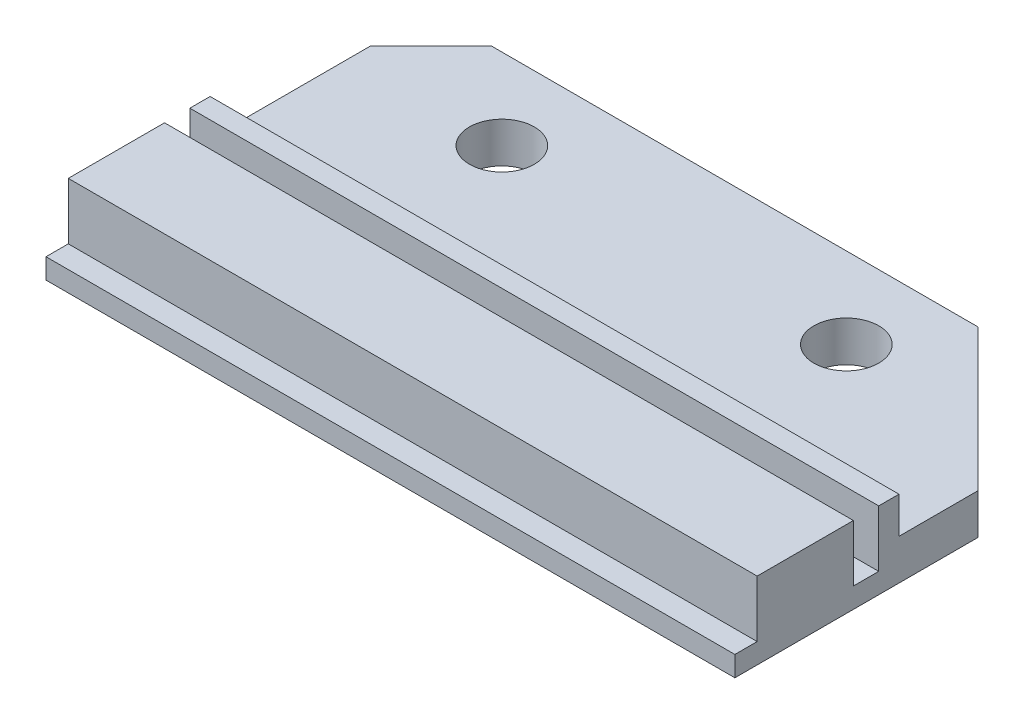
ISO-10303-21;
HEADER;
FILE_DESCRIPTION(('STEP AP214'),'2;1');
FILE_NAME('part.step','',(''),(''),'','','');
FILE_SCHEMA(('AUTOMOTIVE_DESIGN { 1 0 10303 214 1 1 1 1 }'));
ENDSEC;
DATA;
#1=APPLICATION_CONTEXT('core data for automotive mechanical design processes');
#2=APPLICATION_PROTOCOL_DEFINITION('international standard','automotive_design',2000,#1);
#3=PRODUCT_CONTEXT('',#1,'mechanical');
#4=PRODUCT('Part','Part','',(#3));
#5=PRODUCT_RELATED_PRODUCT_CATEGORY('part','',(#4));
#6=PRODUCT_DEFINITION_FORMATION('','',#4);
#7=PRODUCT_DEFINITION_CONTEXT('part definition',#1,'design');
#8=PRODUCT_DEFINITION('design','',#6,#7);
#9=PRODUCT_DEFINITION_SHAPE('','',#8);
#10=(LENGTH_UNIT() NAMED_UNIT(*) SI_UNIT(.MILLI.,.METRE.));
#11=(NAMED_UNIT(*) PLANE_ANGLE_UNIT() SI_UNIT($,.RADIAN.));
#12=(NAMED_UNIT(*) SI_UNIT($,.STERADIAN.) SOLID_ANGLE_UNIT());
#13=UNCERTAINTY_MEASURE_WITH_UNIT(LENGTH_MEASURE(1.E-05),#10,'distance_accuracy_value','');
#14=(GEOMETRIC_REPRESENTATION_CONTEXT(3) GLOBAL_UNCERTAINTY_ASSIGNED_CONTEXT((#13)) GLOBAL_UNIT_ASSIGNED_CONTEXT((#10,
#11,#12)) REPRESENTATION_CONTEXT('',''));
#15=CARTESIAN_POINT('',(0.,0.,0.));
#16=DIRECTION('',(0.,0.,1.));
#17=DIRECTION('',(1.,0.,0.));
#18=AXIS2_PLACEMENT_3D('',#15,#16,#17);
#19=CARTESIAN_POINT('',(0.,1.,0.));
#20=DIRECTION('',(0.,1.,0.));
#21=DIRECTION('',(0.,0.,1.));
#22=AXIS2_PLACEMENT_3D('',#19,#20,#21);
#23=PLANE('',#22);
#24=DIRECTION('',(0.,0.,-1.));
#25=VECTOR('',#24,1.);
#26=CARTESIAN_POINT('',(-7.49999999999999,1.,0.));
#27=LINE('',#26,#25);
#28=CARTESIAN_POINT('',(-7.49999999999999,1.,9.15));
#29=VERTEX_POINT('',#28);
#30=CARTESIAN_POINT('',(-7.49999999999999,1.,7.9));
#31=VERTEX_POINT('',#30);
#32=EDGE_CURVE('E372',#29,#31,#27,.T.);
#33=ORIENTED_EDGE('',*,*,#32,.F.);
#34=DIRECTION('',(-1.,0.,0.));
#35=VECTOR('',#34,1.);
#36=CARTESIAN_POINT('',(-7.5,1.,9.15));
#37=LINE('',#36,#35);
#38=CARTESIAN_POINT('',(26.5,1.,9.15));
#39=VERTEX_POINT('',#38);
#40=EDGE_CURVE('E262',#39,#29,#37,.T.);
#41=ORIENTED_EDGE('',*,*,#40,.F.);
#42=DIRECTION('',(0.,0.,1.));
#43=VECTOR('',#42,1.);
#44=CARTESIAN_POINT('',(26.5,1.,7.9));
#45=LINE('',#44,#43);
#46=CARTESIAN_POINT('',(26.5,1.,7.9));
#47=VERTEX_POINT('',#46);
#48=EDGE_CURVE('E236',#47,#39,#45,.T.);
#49=ORIENTED_EDGE('',*,*,#48,.F.);
#50=DIRECTION('',(1.,0.,0.));
#51=VECTOR('',#50,1.);
#52=CARTESIAN_POINT('',(-7.5,1.,7.9));
#53=LINE('',#52,#51);
#54=EDGE_CURVE('E251',#31,#47,#53,.T.);
#55=ORIENTED_EDGE('',*,*,#54,.F.);
#56=EDGE_LOOP('',(#33,#41,#49,#55));
#57=FACE_BOUND('',#56,.T.);
#58=ADVANCED_FACE('F45',(#57),#23,.T.);
#59=DIRECTION('',(0.,0.,-1.));
#60=VECTOR('',#59,1.);
#61=CARTESIAN_POINT('',(-7.49999999999999,1.,0.));
#62=LINE('',#61,#60);
#63=CARTESIAN_POINT('',(-7.49999999999999,1.,15.));
#64=VERTEX_POINT('',#63);
#65=CARTESIAN_POINT('',(-7.49999999999999,1.,13.9));
#66=VERTEX_POINT('',#65);
#67=EDGE_CURVE('E374',#64,#66,#62,.T.);
#68=ORIENTED_EDGE('',*,*,#67,.F.);
#69=DIRECTION('',(1.,0.,0.));
#70=VECTOR('',#69,1.);
#71=CARTESIAN_POINT('',(-7.5,1.,15.));
#72=LINE('',#71,#70);
#73=CARTESIAN_POINT('',(26.5,1.,15.));
#74=VERTEX_POINT('',#73);
#75=EDGE_CURVE('E177',#64,#74,#72,.T.);
#76=ORIENTED_EDGE('',*,*,#75,.T.);
#77=DIRECTION('',(0.,0.,1.));
#78=VECTOR('',#77,1.);
#79=CARTESIAN_POINT('',(26.5,1.,13.9));
#80=LINE('',#79,#78);
#81=CARTESIAN_POINT('',(26.5,1.,13.9));
#82=VERTEX_POINT('',#81);
#83=EDGE_CURVE('E248',#82,#74,#80,.T.);
#84=ORIENTED_EDGE('',*,*,#83,.F.);
#85=DIRECTION('',(1.,0.,0.));
#86=VECTOR('',#85,1.);
#87=CARTESIAN_POINT('',(-7.5,1.,13.9));
#88=LINE('',#87,#86);
#89=EDGE_CURVE('E256',#66,#82,#88,.T.);
#90=ORIENTED_EDGE('',*,*,#89,.F.);
#91=EDGE_LOOP('',(#68,#76,#84,#90));
#92=FACE_BOUND('',#91,.T.);
#93=ADVANCED_FACE('F305',(#92),#23,.T.);
#94=CARTESIAN_POINT('',(0.,0.,0.));
#95=DIRECTION('',(0.,1.,0.));
#96=DIRECTION('',(0.,0.,1.));
#97=AXIS2_PLACEMENT_3D('',#94,#95,#96);
#98=PLANE('',#97);
#99=DIRECTION('',(0.,0.,1.));
#100=VECTOR('',#99,1.);
#101=CARTESIAN_POINT('',(-7.49999999999999,0.,15.));
#102=LINE('',#101,#100);
#103=CARTESIAN_POINT('',(-7.49999999999999,0.,-0.999999999999971));
#104=VERTEX_POINT('',#103);
#105=CARTESIAN_POINT('',(-7.49999999999999,0.,15.));
#106=VERTEX_POINT('',#105);
#107=EDGE_CURVE('E161',#104,#106,#102,.T.);
#108=ORIENTED_EDGE('',*,*,#107,.F.);
#109=DIRECTION('',(-0.707106781186546,0.,0.707106781186549));
#110=VECTOR('',#109,1.);
#111=CARTESIAN_POINT('',(-4.49999999999998,0.,-4.));
#112=LINE('',#111,#110);
#113=CARTESIAN_POINT('',(-4.49999999999998,0.,-4.));
#114=VERTEX_POINT('',#113);
#115=EDGE_CURVE('E12',#104,#114,#112,.F.);
#116=ORIENTED_EDGE('',*,*,#115,.T.);
#117=DIRECTION('',(-1.,0.,0.));
#118=VECTOR('',#117,1.);
#119=CARTESIAN_POINT('',(-7.5,0.,-4.));
#120=LINE('',#119,#118);
#121=CARTESIAN_POINT('',(19.5,0.,-4.));
#122=VERTEX_POINT('',#121);
#123=EDGE_CURVE('E186',#122,#114,#120,.T.);
#124=ORIENTED_EDGE('',*,*,#123,.F.);
#125=DIRECTION('',(0.707106781186549,0.,0.707106781186546));
#126=VECTOR('',#125,1.);
#127=CARTESIAN_POINT('',(26.5,0.,3.));
#128=LINE('',#127,#126);
#129=CARTESIAN_POINT('',(26.5,0.,3.));
#130=VERTEX_POINT('',#129);
#131=EDGE_CURVE('E200',#122,#130,#128,.T.);
#132=ORIENTED_EDGE('',*,*,#131,.T.);
#133=DIRECTION('',(0.,0.,-1.));
#134=VECTOR('',#133,1.);
#135=CARTESIAN_POINT('',(26.5,0.,15.));
#136=LINE('',#135,#134);
#137=CARTESIAN_POINT('',(26.5,0.,15.));
#138=VERTEX_POINT('',#137);
#139=EDGE_CURVE('E184',#138,#130,#136,.T.);
#140=ORIENTED_EDGE('',*,*,#139,.F.);
#141=DIRECTION('',(1.,0.,0.));
#142=VECTOR('',#141,1.);
#143=CARTESIAN_POINT('',(-7.5,0.,15.));
#144=LINE('',#143,#142);
#145=EDGE_CURVE('E175',#106,#138,#144,.T.);
#146=ORIENTED_EDGE('',*,*,#145,.F.);
#147=EDGE_LOOP('',(#108,#116,#124,#132,#140,#146));
#148=FACE_BOUND('',#147,.T.);
#149=CARTESIAN_POINT('',(0.,0.,0.));
#150=DIRECTION('',(0.,1.,0.));
#151=DIRECTION('',(0.,0.,1.));
#152=AXIS2_PLACEMENT_3D('',#149,#150,#151);
#153=CIRCLE('',#152,1.6);
#154=CARTESIAN_POINT('',(0.,0.,1.6));
#155=VERTEX_POINT('',#154);
#156=EDGE_CURVE('E187',#155,#155,#153,.T.);
#157=ORIENTED_EDGE('',*,*,#156,.T.);
#158=EDGE_LOOP('',(#157));
#159=FACE_BOUND('',#158,.T.);
#160=CARTESIAN_POINT('',(17.,0.,0.));
#161=DIRECTION('',(0.,1.,0.));
#162=DIRECTION('',(0.,0.,1.));
#163=AXIS2_PLACEMENT_3D('',#160,#161,#162);
#164=CIRCLE('',#163,1.60000000000001);
#165=CARTESIAN_POINT('',(17.,0.,1.6));
#166=VERTEX_POINT('',#165);
#167=EDGE_CURVE('E192',#166,#166,#164,.T.);
#168=ORIENTED_EDGE('',*,*,#167,.T.);
#169=EDGE_LOOP('',(#168));
#170=FACE_BOUND('',#169,.T.);
#171=ADVANCED_FACE('F181',(#148,#159,#170),#98,.F.);
#172=CARTESIAN_POINT('',(-7.5,1.,15.));
#173=DIRECTION('',(0.,0.,-1.));
#174=DIRECTION('',(-1.,0.,0.));
#175=AXIS2_PLACEMENT_3D('',#172,#173,#174);
#176=PLANE('',#175);
#177=ORIENTED_EDGE('',*,*,#75,.F.);
#178=DIRECTION('',(0.,-1.,0.));
#179=VECTOR('',#178,1.);
#180=CARTESIAN_POINT('',(-7.49999999999999,3.8,15.));
#181=LINE('',#180,#179);
#182=EDGE_CURVE('E164',#64,#106,#181,.T.);
#183=ORIENTED_EDGE('',*,*,#182,.T.);
#184=ORIENTED_EDGE('',*,*,#145,.T.);
#185=DIRECTION('',(0.,-1.,0.));
#186=VECTOR('',#185,1.);
#187=CARTESIAN_POINT('',(26.5,1.,15.));
#188=LINE('',#187,#186);
#189=EDGE_CURVE('E220',#74,#138,#188,.T.);
#190=ORIENTED_EDGE('',*,*,#189,.F.);
#191=EDGE_LOOP('',(#177,#183,#184,#190));
#192=FACE_BOUND('',#191,.T.);
#193=ADVANCED_FACE('F173',(#192),#176,.F.);
#194=CARTESIAN_POINT('',(-7.5,1.,-4.));
#195=DIRECTION('',(0.,0.,1.));
#196=DIRECTION('',(1.,0.,0.));
#197=AXIS2_PLACEMENT_3D('',#194,#195,#196);
#198=PLANE('',#197);
#199=ORIENTED_EDGE('',*,*,#123,.T.);
#200=DIRECTION('',(0.,1.,0.));
#201=VECTOR('',#200,1.);
#202=CARTESIAN_POINT('',(-4.49999999999998,1.,-4.));
#203=LINE('',#202,#201);
#204=CARTESIAN_POINT('',(-4.49999999999997,2.,-4.));
#205=VERTEX_POINT('',#204);
#206=EDGE_CURVE('E204',#114,#205,#203,.T.);
#207=ORIENTED_EDGE('',*,*,#206,.T.);
#208=DIRECTION('',(-1.,0.,0.));
#209=VECTOR('',#208,1.);
#210=CARTESIAN_POINT('',(19.5,2.,-4.));
#211=LINE('',#210,#209);
#212=CARTESIAN_POINT('',(19.5,2.,-4.));
#213=VERTEX_POINT('',#212);
#214=EDGE_CURVE('E211',#213,#205,#211,.T.);
#215=ORIENTED_EDGE('',*,*,#214,.F.);
#216=DIRECTION('',(0.,-1.,0.));
#217=VECTOR('',#216,1.);
#218=CARTESIAN_POINT('',(19.5,0.,-4.));
#219=LINE('',#218,#217);
#220=EDGE_CURVE('E198',#213,#122,#219,.T.);
#221=ORIENTED_EDGE('',*,*,#220,.T.);
#222=EDGE_LOOP('',(#199,#207,#215,#221));
#223=FACE_BOUND('',#222,.T.);
#224=ADVANCED_FACE('F210',(#223),#198,.F.);
#225=CARTESIAN_POINT('',(0.,1.,0.));
#226=DIRECTION('',(0.,-1.,0.));
#227=DIRECTION('',(0.,0.,-1.));
#228=AXIS2_PLACEMENT_3D('',#225,#226,#227);
#229=CYLINDRICAL_SURFACE('',#228,1.6);
#230=ORIENTED_EDGE('',*,*,#156,.F.);
#231=EDGE_LOOP('',(#230));
#232=FACE_BOUND('',#231,.T.);
#233=CARTESIAN_POINT('',(0.,2.,0.));
#234=DIRECTION('',(0.,1.,0.));
#235=DIRECTION('',(0.,0.,1.));
#236=AXIS2_PLACEMENT_3D('',#233,#234,#235);
#237=CIRCLE('',#236,1.6);
#238=CARTESIAN_POINT('',(0.,2.,1.6));
#239=VERTEX_POINT('',#238);
#240=EDGE_CURVE('E282',#239,#239,#237,.T.);
#241=ORIENTED_EDGE('',*,*,#240,.T.);
#242=EDGE_LOOP('',(#241));
#243=FACE_BOUND('',#242,.T.);
#244=ADVANCED_FACE('F276',(#232,#243),#229,.F.);
#245=CARTESIAN_POINT('',(17.,1.,0.));
#246=DIRECTION('',(0.,-1.,0.));
#247=DIRECTION('',(0.,0.,-1.));
#248=AXIS2_PLACEMENT_3D('',#245,#246,#247);
#249=CYLINDRICAL_SURFACE('',#248,1.60000000000001);
#250=ORIENTED_EDGE('',*,*,#167,.F.);
#251=EDGE_LOOP('',(#250));
#252=FACE_BOUND('',#251,.T.);
#253=CARTESIAN_POINT('',(17.,2.,0.));
#254=DIRECTION('',(0.,1.,0.));
#255=DIRECTION('',(0.,0.,1.));
#256=AXIS2_PLACEMENT_3D('',#253,#254,#255);
#257=CIRCLE('',#256,1.60000000000001);
#258=CARTESIAN_POINT('',(17.,2.,1.6));
#259=VERTEX_POINT('',#258);
#260=EDGE_CURVE('E280',#259,#259,#257,.T.);
#261=ORIENTED_EDGE('',*,*,#260,.T.);
#262=EDGE_LOOP('',(#261));
#263=FACE_BOUND('',#262,.T.);
#264=ADVANCED_FACE('F272',(#252,#263),#249,.F.);
#265=CARTESIAN_POINT('',(-7.5,3.8,13.9));
#266=DIRECTION('',(0.,0.,-1.));
#267=DIRECTION('',(-1.,0.,0.));
#268=AXIS2_PLACEMENT_3D('',#265,#266,#267);
#269=PLANE('',#268);
#270=DIRECTION('',(1.,0.,0.));
#271=VECTOR('',#270,1.);
#272=CARTESIAN_POINT('',(-7.5,3.8,13.9));
#273=LINE('',#272,#271);
#274=CARTESIAN_POINT('',(-7.49999999999999,3.8,13.9));
#275=VERTEX_POINT('',#274);
#276=CARTESIAN_POINT('',(26.5,3.8,13.9));
#277=VERTEX_POINT('',#276);
#278=EDGE_CURVE('E259',#275,#277,#273,.T.);
#279=ORIENTED_EDGE('',*,*,#278,.F.);
#280=DIRECTION('',(0.,-1.,0.));
#281=VECTOR('',#280,1.);
#282=CARTESIAN_POINT('',(-7.49999999999999,3.8,13.9));
#283=LINE('',#282,#281);
#284=EDGE_CURVE('E363',#275,#66,#283,.T.);
#285=ORIENTED_EDGE('',*,*,#284,.T.);
#286=ORIENTED_EDGE('',*,*,#89,.T.);
#287=DIRECTION('',(0.,-1.,0.));
#288=VECTOR('',#287,1.);
#289=CARTESIAN_POINT('',(26.5,3.8,13.9));
#290=LINE('',#289,#288);
#291=EDGE_CURVE('E245',#277,#82,#290,.T.);
#292=ORIENTED_EDGE('',*,*,#291,.F.);
#293=EDGE_LOOP('',(#279,#285,#286,#292));
#294=FACE_BOUND('',#293,.T.);
#295=ADVANCED_FACE('F275',(#294),#269,.F.);
#296=CARTESIAN_POINT('',(-7.5,3.8,9.15));
#297=DIRECTION('',(0.,0.,1.));
#298=DIRECTION('',(1.,0.,0.));
#299=AXIS2_PLACEMENT_3D('',#296,#297,#298);
#300=PLANE('',#299);
#301=ORIENTED_EDGE('',*,*,#40,.T.);
#302=DIRECTION('',(0.,1.,0.));
#303=VECTOR('',#302,1.);
#304=CARTESIAN_POINT('',(-7.49999999999999,3.8,9.15));
#305=LINE('',#304,#303);
#306=CARTESIAN_POINT('',(-7.49999999999999,3.8,9.15));
#307=VERTEX_POINT('',#306);
#308=EDGE_CURVE('E371',#29,#307,#305,.T.);
#309=ORIENTED_EDGE('',*,*,#308,.T.);
#310=DIRECTION('',(-1.,0.,0.));
#311=VECTOR('',#310,1.);
#312=CARTESIAN_POINT('',(-7.5,3.8,9.15));
#313=LINE('',#312,#311);
#314=CARTESIAN_POINT('',(26.5,3.8,9.15));
#315=VERTEX_POINT('',#314);
#316=EDGE_CURVE('E261',#315,#307,#313,.T.);
#317=ORIENTED_EDGE('',*,*,#316,.F.);
#318=DIRECTION('',(0.,1.,0.));
#319=VECTOR('',#318,1.);
#320=CARTESIAN_POINT('',(26.5,1.,9.15));
#321=LINE('',#320,#319);
#322=EDGE_CURVE('E239',#39,#315,#321,.T.);
#323=ORIENTED_EDGE('',*,*,#322,.F.);
#324=EDGE_LOOP('',(#301,#309,#317,#323));
#325=FACE_BOUND('',#324,.T.);
#326=ADVANCED_FACE('F351',(#325),#300,.F.);
#327=CARTESIAN_POINT('',(0.,3.8,0.));
#328=DIRECTION('',(0.,1.,0.));
#329=DIRECTION('',(0.,0.,1.));
#330=AXIS2_PLACEMENT_3D('',#327,#328,#329);
#331=PLANE('',#330);
#332=DIRECTION('',(0.,0.,1.));
#333=VECTOR('',#332,1.);
#334=CARTESIAN_POINT('',(-7.49999999999999,3.8,15.));
#335=LINE('',#334,#333);
#336=EDGE_CURVE('E169',#307,#275,#335,.T.);
#337=ORIENTED_EDGE('',*,*,#336,.T.);
#338=ORIENTED_EDGE('',*,*,#278,.T.);
#339=DIRECTION('',(0.,0.,1.));
#340=VECTOR('',#339,1.);
#341=CARTESIAN_POINT('',(26.5,3.8,9.15));
#342=LINE('',#341,#340);
#343=EDGE_CURVE('E242',#315,#277,#342,.T.);
#344=ORIENTED_EDGE('',*,*,#343,.F.);
#345=ORIENTED_EDGE('',*,*,#316,.T.);
#346=EDGE_LOOP('',(#337,#338,#344,#345));
#347=FACE_BOUND('',#346,.T.);
#348=ADVANCED_FACE('F346',(#347),#331,.T.);
#349=CARTESIAN_POINT('',(-7.5,35.8156211871642,7.9));
#350=DIRECTION('',(0.,0.,-1.));
#351=DIRECTION('',(-1.,0.,0.));
#352=AXIS2_PLACEMENT_3D('',#349,#350,#351);
#353=PLANE('',#352);
#354=DIRECTION('',(1.,0.,0.));
#355=VECTOR('',#354,1.);
#356=CARTESIAN_POINT('',(-7.5,3.8,7.9));
#357=LINE('',#356,#355);
#358=CARTESIAN_POINT('',(-7.49999999999999,3.8,7.9));
#359=VERTEX_POINT('',#358);
#360=CARTESIAN_POINT('',(26.5,3.8,7.9));
#361=VERTEX_POINT('',#360);
#362=EDGE_CURVE('E254',#359,#361,#357,.T.);
#363=ORIENTED_EDGE('',*,*,#362,.F.);
#364=DIRECTION('',(0.,-1.,0.));
#365=VECTOR('',#364,1.);
#366=CARTESIAN_POINT('',(-7.49999999999999,35.8156211871642,7.9));
#367=LINE('',#366,#365);
#368=EDGE_CURVE('E376',#359,#31,#367,.T.);
#369=ORIENTED_EDGE('',*,*,#368,.T.);
#370=ORIENTED_EDGE('',*,*,#54,.T.);
#371=DIRECTION('',(0.,-1.,0.));
#372=VECTOR('',#371,1.);
#373=CARTESIAN_POINT('',(26.5,3.8,7.9));
#374=LINE('',#373,#372);
#375=EDGE_CURVE('E233',#361,#47,#374,.T.);
#376=ORIENTED_EDGE('',*,*,#375,.F.);
#377=EDGE_LOOP('',(#363,#369,#370,#376));
#378=FACE_BOUND('',#377,.T.);
#379=ADVANCED_FACE('F343',(#378),#353,.F.);
#380=CARTESIAN_POINT('',(-7.5,35.8156211871642,6.9));
#381=DIRECTION('',(0.,0.,1.));
#382=DIRECTION('',(1.,0.,0.));
#383=AXIS2_PLACEMENT_3D('',#380,#381,#382);
#384=PLANE('',#383);
#385=DIRECTION('',(-1.,0.,0.));
#386=VECTOR('',#385,1.);
#387=CARTESIAN_POINT('',(-10.5,1.,6.9));
#388=LINE('',#387,#386);
#389=CARTESIAN_POINT('',(16.5,1.,6.9));
#390=VERTEX_POINT('',#389);
#391=CARTESIAN_POINT('',(-7.49999999999999,1.,6.9));
#392=VERTEX_POINT('',#391);
#393=EDGE_CURVE('E286',#390,#392,#388,.T.);
#394=ORIENTED_EDGE('',*,*,#393,.T.);
#395=DIRECTION('',(0.,1.,0.));
#396=VECTOR('',#395,1.);
#397=CARTESIAN_POINT('',(-7.49999999999999,35.8156211871642,6.9));
#398=LINE('',#397,#396);
#399=CARTESIAN_POINT('',(-7.49999999999999,3.8,6.9));
#400=VERTEX_POINT('',#399);
#401=EDGE_CURVE('E399',#392,#400,#398,.T.);
#402=ORIENTED_EDGE('',*,*,#401,.T.);
#403=DIRECTION('',(-1.,0.,0.));
#404=VECTOR('',#403,1.);
#405=CARTESIAN_POINT('',(-7.5,3.8,6.9));
#406=LINE('',#405,#404);
#407=CARTESIAN_POINT('',(26.5,3.8,6.9));
#408=VERTEX_POINT('',#407);
#409=EDGE_CURVE('E253',#408,#400,#406,.T.);
#410=ORIENTED_EDGE('',*,*,#409,.F.);
#411=DIRECTION('',(0.,1.,0.));
#412=VECTOR('',#411,1.);
#413=CARTESIAN_POINT('',(26.5,1.,6.9));
#414=LINE('',#413,#412);
#415=CARTESIAN_POINT('',(26.5,2.,6.9));
#416=VERTEX_POINT('',#415);
#417=EDGE_CURVE('E228',#416,#408,#414,.T.);
#418=ORIENTED_EDGE('',*,*,#417,.F.);
#419=DIRECTION('',(1.,0.,0.));
#420=VECTOR('',#419,1.);
#421=CARTESIAN_POINT('',(-14.5,2.,6.9));
#422=LINE('',#421,#420);
#423=CARTESIAN_POINT('',(16.5,2.,6.9));
#424=VERTEX_POINT('',#423);
#425=EDGE_CURVE('E281',#424,#416,#422,.T.);
#426=ORIENTED_EDGE('',*,*,#425,.F.);
#427=DIRECTION('',(0.,1.,0.));
#428=VECTOR('',#427,1.);
#429=CARTESIAN_POINT('',(16.5,-27.0416345659799,6.9));
#430=LINE('',#429,#428);
#431=EDGE_CURVE('E392',#390,#424,#430,.T.);
#432=ORIENTED_EDGE('',*,*,#431,.F.);
#433=EDGE_LOOP('',(#394,#402,#410,#418,#426,#432));
#434=FACE_BOUND('',#433,.T.);
#435=ADVANCED_FACE('F336',(#434),#384,.F.);
#436=CARTESIAN_POINT('',(0.,3.8,0.));
#437=DIRECTION('',(0.,1.,0.));
#438=DIRECTION('',(0.,0.,1.));
#439=AXIS2_PLACEMENT_3D('',#436,#437,#438);
#440=PLANE('',#439);
#441=EDGE_CURVE('E179',#400,#359,#335,.T.);
#442=ORIENTED_EDGE('',*,*,#441,.T.);
#443=ORIENTED_EDGE('',*,*,#362,.T.);
#444=DIRECTION('',(0.,0.,1.));
#445=VECTOR('',#444,1.);
#446=CARTESIAN_POINT('',(26.5,3.8,6.9));
#447=LINE('',#446,#445);
#448=EDGE_CURVE('E230',#408,#361,#447,.T.);
#449=ORIENTED_EDGE('',*,*,#448,.F.);
#450=ORIENTED_EDGE('',*,*,#409,.T.);
#451=EDGE_LOOP('',(#442,#443,#449,#450));
#452=FACE_BOUND('',#451,.T.);
#453=ADVANCED_FACE('F331',(#452),#440,.T.);
#454=CARTESIAN_POINT('',(26.5,0.,0.));
#455=DIRECTION('',(1.,0.,0.));
#456=DIRECTION('',(0.,0.,-1.));
#457=AXIS2_PLACEMENT_3D('',#454,#455,#456);
#458=PLANE('',#457);
#459=ORIENTED_EDGE('',*,*,#139,.T.);
#460=DIRECTION('',(0.,1.,0.));
#461=VECTOR('',#460,1.);
#462=CARTESIAN_POINT('',(26.5,1.,3.));
#463=LINE('',#462,#461);
#464=CARTESIAN_POINT('',(26.5,2.,3.));
#465=VERTEX_POINT('',#464);
#466=EDGE_CURVE('E196',#130,#465,#463,.T.);
#467=ORIENTED_EDGE('',*,*,#466,.T.);
#468=DIRECTION('',(0.,0.,-1.));
#469=VECTOR('',#468,1.);
#470=CARTESIAN_POINT('',(26.5,2.,6.9));
#471=LINE('',#470,#469);
#472=EDGE_CURVE('E223',#416,#465,#471,.T.);
#473=ORIENTED_EDGE('',*,*,#472,.F.);
#474=ORIENTED_EDGE('',*,*,#417,.T.);
#475=ORIENTED_EDGE('',*,*,#448,.T.);
#476=ORIENTED_EDGE('',*,*,#375,.T.);
#477=ORIENTED_EDGE('',*,*,#48,.T.);
#478=ORIENTED_EDGE('',*,*,#322,.T.);
#479=ORIENTED_EDGE('',*,*,#343,.T.);
#480=ORIENTED_EDGE('',*,*,#291,.T.);
#481=ORIENTED_EDGE('',*,*,#83,.T.);
#482=ORIENTED_EDGE('',*,*,#189,.T.);
#483=EDGE_LOOP('',(#459,#467,#473,#474,#475,#476,#477,#478,#479,#480,#481,#482));
#484=FACE_BOUND('',#483,.T.);
#485=ADVANCED_FACE('F324',(#484),#458,.T.);
#486=CARTESIAN_POINT('',(26.5,0.,3.));
#487=DIRECTION('',(0.707106781186546,0.,-0.707106781186549));
#488=DIRECTION('',(0.,-1.,0.));
#489=AXIS2_PLACEMENT_3D('',#486,#487,#488);
#490=PLANE('',#489);
#491=ORIENTED_EDGE('',*,*,#131,.F.);
#492=ORIENTED_EDGE('',*,*,#220,.F.);
#493=DIRECTION('',(-0.707106781186549,0.,-0.707106781186546));
#494=VECTOR('',#493,1.);
#495=CARTESIAN_POINT('',(26.5,2.,3.));
#496=LINE('',#495,#494);
#497=EDGE_CURVE('E219',#465,#213,#496,.T.);
#498=ORIENTED_EDGE('',*,*,#497,.F.);
#499=ORIENTED_EDGE('',*,*,#466,.F.);
#500=EDGE_LOOP('',(#491,#492,#498,#499));
#501=FACE_BOUND('',#500,.T.);
#502=ADVANCED_FACE('F297',(#501),#490,.T.);
#503=CARTESIAN_POINT('',(0.,2.,0.));
#504=DIRECTION('',(0.,1.,0.));
#505=DIRECTION('',(0.,0.,1.));
#506=AXIS2_PLACEMENT_3D('',#503,#504,#505);
#507=PLANE('',#506);
#508=ORIENTED_EDGE('',*,*,#214,.T.);
#509=DIRECTION('',(0.707106781186546,0.,-0.707106781186549));
#510=VECTOR('',#509,1.);
#511=CARTESIAN_POINT('',(-4.25,2.,-4.24999999999998));
#512=LINE('',#511,#510);
#513=CARTESIAN_POINT('',(-7.49999999999999,2.,-0.999999999999971));
#514=VERTEX_POINT('',#513);
#515=EDGE_CURVE('E68',#205,#514,#512,.F.);
#516=ORIENTED_EDGE('',*,*,#515,.T.);
#517=DIRECTION('',(0.,0.,-1.));
#518=VECTOR('',#517,1.);
#519=CARTESIAN_POINT('',(-7.49999999999999,2.,0.));
#520=LINE('',#519,#518);
#521=CARTESIAN_POINT('',(-7.49999999999999,2.,5.4));
#522=VERTEX_POINT('',#521);
#523=EDGE_CURVE('E408',#522,#514,#520,.T.);
#524=ORIENTED_EDGE('',*,*,#523,.F.);
#525=DIRECTION('',(-1.,0.,0.));
#526=VECTOR('',#525,1.);
#527=CARTESIAN_POINT('',(-10.5,2.,5.4));
#528=LINE('',#527,#526);
#529=CARTESIAN_POINT('',(16.5,2.,5.4));
#530=VERTEX_POINT('',#529);
#531=EDGE_CURVE('E389',#530,#522,#528,.T.);
#532=ORIENTED_EDGE('',*,*,#531,.F.);
#533=DIRECTION('',(0.,0.,-1.));
#534=VECTOR('',#533,1.);
#535=CARTESIAN_POINT('',(16.5,2.,6.9));
#536=LINE('',#535,#534);
#537=EDGE_CURVE('E381',#424,#530,#536,.T.);
#538=ORIENTED_EDGE('',*,*,#537,.F.);
#539=ORIENTED_EDGE('',*,*,#425,.T.);
#540=ORIENTED_EDGE('',*,*,#472,.T.);
#541=ORIENTED_EDGE('',*,*,#497,.T.);
#542=EDGE_LOOP('',(#508,#516,#524,#532,#538,#539,#540,#541));
#543=FACE_BOUND('',#542,.T.);
#544=ORIENTED_EDGE('',*,*,#260,.F.);
#545=EDGE_LOOP('',(#544));
#546=FACE_BOUND('',#545,.T.);
#547=ORIENTED_EDGE('',*,*,#240,.F.);
#548=EDGE_LOOP('',(#547));
#549=FACE_BOUND('',#548,.T.);
#550=ADVANCED_FACE('F215',(#543,#546,#549),#507,.T.);
#551=CARTESIAN_POINT('',(-10.5,-27.0416345659799,5.4));
#552=DIRECTION('',(0.,0.,-1.));
#553=DIRECTION('',(-1.,0.,0.));
#554=AXIS2_PLACEMENT_3D('',#551,#552,#553);
#555=PLANE('',#554);
#556=ORIENTED_EDGE('',*,*,#531,.T.);
#557=DIRECTION('',(0.,-1.,0.));
#558=VECTOR('',#557,1.);
#559=CARTESIAN_POINT('',(-7.49999999999999,-27.0416345659799,5.4));
#560=LINE('',#559,#558);
#561=CARTESIAN_POINT('',(-7.49999999999999,1.,5.4));
#562=VERTEX_POINT('',#561);
#563=EDGE_CURVE('E178',#522,#562,#560,.T.);
#564=ORIENTED_EDGE('',*,*,#563,.T.);
#565=DIRECTION('',(1.,0.,0.));
#566=VECTOR('',#565,1.);
#567=CARTESIAN_POINT('',(-10.5,1.,5.4));
#568=LINE('',#567,#566);
#569=CARTESIAN_POINT('',(16.5,1.,5.4));
#570=VERTEX_POINT('',#569);
#571=EDGE_CURVE('E384',#562,#570,#568,.T.);
#572=ORIENTED_EDGE('',*,*,#571,.T.);
#573=DIRECTION('',(0.,1.,0.));
#574=VECTOR('',#573,1.);
#575=CARTESIAN_POINT('',(16.5,-27.0416345659799,5.4));
#576=LINE('',#575,#574);
#577=EDGE_CURVE('E385',#570,#530,#576,.T.);
#578=ORIENTED_EDGE('',*,*,#577,.T.);
#579=EDGE_LOOP('',(#556,#564,#572,#578));
#580=FACE_BOUND('',#579,.T.);
#581=ADVANCED_FACE('F329',(#580),#555,.F.);
#582=CARTESIAN_POINT('',(16.5,-27.0416345659799,6.9));
#583=DIRECTION('',(1.,0.,0.));
#584=DIRECTION('',(0.,0.,-1.));
#585=AXIS2_PLACEMENT_3D('',#582,#583,#584);
#586=PLANE('',#585);
#587=DIRECTION('',(0.,0.,1.));
#588=VECTOR('',#587,1.);
#589=CARTESIAN_POINT('',(16.5,1.,6.9));
#590=LINE('',#589,#588);
#591=EDGE_CURVE('E382',#570,#390,#590,.T.);
#592=ORIENTED_EDGE('',*,*,#591,.T.);
#593=ORIENTED_EDGE('',*,*,#431,.T.);
#594=ORIENTED_EDGE('',*,*,#537,.T.);
#595=ORIENTED_EDGE('',*,*,#577,.F.);
#596=EDGE_LOOP('',(#592,#593,#594,#595));
#597=FACE_BOUND('',#596,.T.);
#598=ADVANCED_FACE('F420',(#597),#586,.F.);
#599=CARTESIAN_POINT('',(0.,1.,0.));
#600=DIRECTION('',(0.,1.,0.));
#601=DIRECTION('',(0.,0.,1.));
#602=AXIS2_PLACEMENT_3D('',#599,#600,#601);
#603=PLANE('',#602);
#604=DIRECTION('',(0.,0.,-1.));
#605=VECTOR('',#604,1.);
#606=CARTESIAN_POINT('',(-7.49999999999999,1.,0.));
#607=LINE('',#606,#605);
#608=EDGE_CURVE('E202',#392,#562,#607,.T.);
#609=ORIENTED_EDGE('',*,*,#608,.F.);
#610=ORIENTED_EDGE('',*,*,#393,.F.);
#611=ORIENTED_EDGE('',*,*,#591,.F.);
#612=ORIENTED_EDGE('',*,*,#571,.F.);
#613=EDGE_LOOP('',(#609,#610,#611,#612));
#614=FACE_BOUND('',#613,.T.);
#615=ADVANCED_FACE('F302',(#614),#603,.T.);
#616=CARTESIAN_POINT('',(-7.49999999999999,3.8,15.));
#617=DIRECTION('',(1.,0.,0.));
#618=DIRECTION('',(0.,0.,-1.));
#619=AXIS2_PLACEMENT_3D('',#616,#617,#618);
#620=PLANE('',#619);
#621=ORIENTED_EDGE('',*,*,#523,.T.);
#622=DIRECTION('',(0.,-1.,0.));
#623=VECTOR('',#622,1.);
#624=CARTESIAN_POINT('',(-7.49999999999999,3.8,-0.999999999999971));
#625=LINE('',#624,#623);
#626=EDGE_CURVE('E54',#514,#104,#625,.T.);
#627=ORIENTED_EDGE('',*,*,#626,.T.);
#628=ORIENTED_EDGE('',*,*,#107,.T.);
#629=ORIENTED_EDGE('',*,*,#182,.F.);
#630=ORIENTED_EDGE('',*,*,#67,.T.);
#631=ORIENTED_EDGE('',*,*,#284,.F.);
#632=ORIENTED_EDGE('',*,*,#336,.F.);
#633=ORIENTED_EDGE('',*,*,#308,.F.);
#634=ORIENTED_EDGE('',*,*,#32,.T.);
#635=ORIENTED_EDGE('',*,*,#368,.F.);
#636=ORIENTED_EDGE('',*,*,#441,.F.);
#637=ORIENTED_EDGE('',*,*,#401,.F.);
#638=ORIENTED_EDGE('',*,*,#608,.T.);
#639=ORIENTED_EDGE('',*,*,#563,.F.);
#640=EDGE_LOOP('',(#621,#627,#628,#629,#630,#631,#632,#633,#634,#635,#636,#637,#638,#639));
#641=FACE_BOUND('',#640,.T.);
#642=ADVANCED_FACE('F163',(#641),#620,.F.);
#643=CARTESIAN_POINT('',(-4.49999999999998,1.,-4.));
#644=DIRECTION('',(0.707106781186549,0.,0.707106781186546));
#645=DIRECTION('',(0.,1.,0.));
#646=AXIS2_PLACEMENT_3D('',#643,#644,#645);
#647=PLANE('',#646);
#648=ORIENTED_EDGE('',*,*,#115,.F.);
#649=ORIENTED_EDGE('',*,*,#626,.F.);
#650=ORIENTED_EDGE('',*,*,#515,.F.);
#651=ORIENTED_EDGE('',*,*,#206,.F.);
#652=EDGE_LOOP('',(#648,#649,#650,#651));
#653=FACE_BOUND('',#652,.T.);
#654=ADVANCED_FACE('F48',(#653),#647,.F.);
#655=CLOSED_SHELL('',(#58,#93,#171,#193,#224,#244,#264,#295,#326,#348,#379,#435,#453,#485,#502,
#550,#581,#598,#615,#642,#654));
#656=MANIFOLD_SOLID_BREP('B2',#655);
#657=ADVANCED_BREP_SHAPE_REPRESENTATION('',(#18,#656),#14);
#658=SHAPE_DEFINITION_REPRESENTATION(#9,#657);
ENDSEC;
END-ISO-10303-21;
